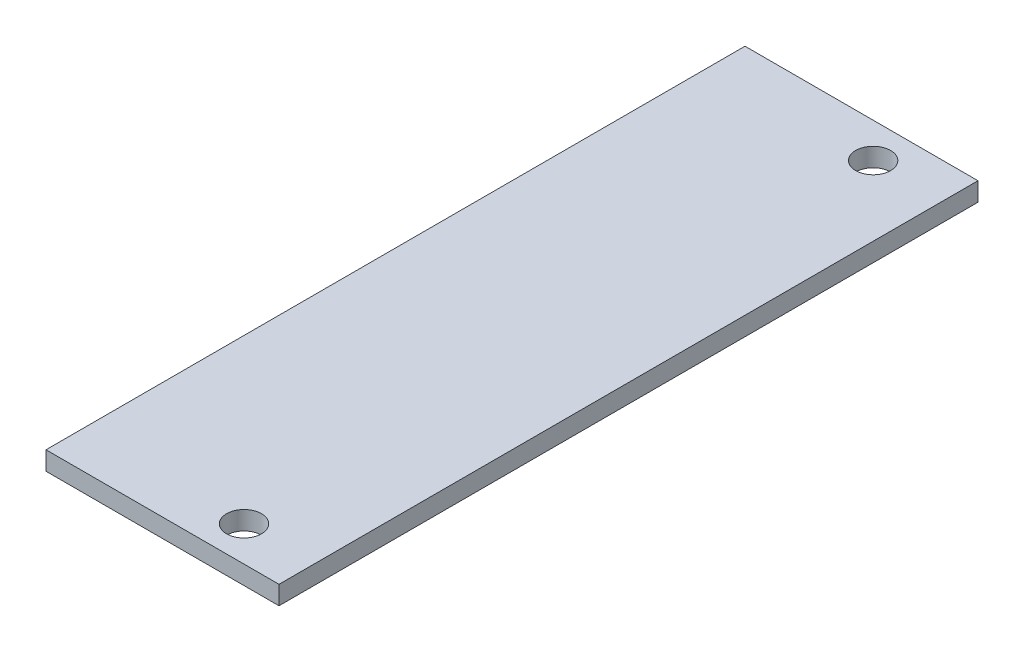
ISO-10303-21;
HEADER;
FILE_DESCRIPTION(('STEP AP214'),'2;1');
FILE_NAME('part.step','',(''),(''),'','','');
FILE_SCHEMA(('AUTOMOTIVE_DESIGN { 1 0 10303 214 1 1 1 1 }'));
ENDSEC;
DATA;
#1=APPLICATION_CONTEXT('core data for automotive mechanical design processes');
#2=APPLICATION_PROTOCOL_DEFINITION('international standard','automotive_design',2000,#1);
#3=PRODUCT_CONTEXT('',#1,'mechanical');
#4=PRODUCT('Part','Part','',(#3));
#5=PRODUCT_RELATED_PRODUCT_CATEGORY('part','',(#4));
#6=PRODUCT_DEFINITION_FORMATION('','',#4);
#7=PRODUCT_DEFINITION_CONTEXT('part definition',#1,'design');
#8=PRODUCT_DEFINITION('design','',#6,#7);
#9=PRODUCT_DEFINITION_SHAPE('','',#8);
#10=(LENGTH_UNIT() NAMED_UNIT(*) SI_UNIT(.MILLI.,.METRE.));
#11=(NAMED_UNIT(*) PLANE_ANGLE_UNIT() SI_UNIT($,.RADIAN.));
#12=(NAMED_UNIT(*) SI_UNIT($,.STERADIAN.) SOLID_ANGLE_UNIT());
#13=UNCERTAINTY_MEASURE_WITH_UNIT(LENGTH_MEASURE(1.E-05),#10,'distance_accuracy_value','');
#14=(GEOMETRIC_REPRESENTATION_CONTEXT(3) GLOBAL_UNCERTAINTY_ASSIGNED_CONTEXT((#13)) GLOBAL_UNIT_ASSIGNED_CONTEXT((#10,
#11,#12)) REPRESENTATION_CONTEXT('',''));
#15=CARTESIAN_POINT('',(0.,0.,0.));
#16=DIRECTION('',(0.,0.,1.));
#17=DIRECTION('',(1.,0.,0.));
#18=AXIS2_PLACEMENT_3D('',#15,#16,#17);
#19=CARTESIAN_POINT('',(0.,1.6,0.));
#20=DIRECTION('',(0.,-1.,0.));
#21=DIRECTION('',(0.,0.,-1.));
#22=AXIS2_PLACEMENT_3D('',#19,#20,#21);
#23=PLANE('',#22);
#24=DIRECTION('',(0.,0.,1.));
#25=VECTOR('',#24,1.);
#26=CARTESIAN_POINT('',(0.,1.6,0.));
#27=LINE('',#26,#25);
#28=CARTESIAN_POINT('',(0.,1.6,-60.));
#29=VERTEX_POINT('',#28);
#30=CARTESIAN_POINT('',(0.,1.6,0.));
#31=VERTEX_POINT('',#30);
#32=EDGE_CURVE('E91',#29,#31,#27,.T.);
#33=ORIENTED_EDGE('',*,*,#32,.T.);
#34=DIRECTION('',(1.,0.,0.));
#35=VECTOR('',#34,1.);
#36=CARTESIAN_POINT('',(0.,1.6,0.));
#37=LINE('',#36,#35);
#38=CARTESIAN_POINT('',(20.,1.6,0.));
#39=VERTEX_POINT('',#38);
#40=EDGE_CURVE('E86',#31,#39,#37,.T.);
#41=ORIENTED_EDGE('',*,*,#40,.T.);
#42=DIRECTION('',(0.,0.,-1.));
#43=VECTOR('',#42,1.);
#44=CARTESIAN_POINT('',(20.,1.6,0.));
#45=LINE('',#44,#43);
#46=CARTESIAN_POINT('',(20.,1.6,-60.));
#47=VERTEX_POINT('',#46);
#48=EDGE_CURVE('E93',#39,#47,#45,.T.);
#49=ORIENTED_EDGE('',*,*,#48,.T.);
#50=DIRECTION('',(-1.,0.,0.));
#51=VECTOR('',#50,1.);
#52=CARTESIAN_POINT('',(0.,1.6,-60.));
#53=LINE('',#52,#51);
#54=EDGE_CURVE('E59',#47,#29,#53,.T.);
#55=ORIENTED_EDGE('',*,*,#54,.T.);
#56=EDGE_LOOP('',(#33,#41,#49,#55));
#57=FACE_BOUND('',#56,.T.);
#58=CARTESIAN_POINT('',(14.,1.6,-3.));
#59=DIRECTION('',(0.,1.,0.));
#60=DIRECTION('',(0.,0.,1.));
#61=AXIS2_PLACEMENT_3D('',#58,#59,#60);
#62=CIRCLE('',#61,1.5);
#63=CARTESIAN_POINT('',(14.,1.6,-1.5));
#64=VERTEX_POINT('',#63);
#65=EDGE_CURVE('E107',#64,#64,#62,.T.);
#66=ORIENTED_EDGE('',*,*,#65,.F.);
#67=EDGE_LOOP('',(#66));
#68=FACE_BOUND('',#67,.T.);
#69=CARTESIAN_POINT('',(14.,1.6,-57.));
#70=DIRECTION('',(0.,1.,0.));
#71=DIRECTION('',(0.,0.,1.));
#72=AXIS2_PLACEMENT_3D('',#69,#70,#71);
#73=CIRCLE('',#72,1.5);
#74=CARTESIAN_POINT('',(14.,1.6,-55.5));
#75=VERTEX_POINT('',#74);
#76=EDGE_CURVE('E125',#75,#75,#73,.T.);
#77=ORIENTED_EDGE('',*,*,#76,.F.);
#78=EDGE_LOOP('',(#77));
#79=FACE_BOUND('',#78,.T.);
#80=ADVANCED_FACE('F41',(#57,#68,#79),#23,.F.);
#81=CARTESIAN_POINT('',(0.,0.,0.));
#82=DIRECTION('',(0.,-1.,0.));
#83=DIRECTION('',(0.,0.,-1.));
#84=AXIS2_PLACEMENT_3D('',#81,#82,#83);
#85=PLANE('',#84);
#86=CARTESIAN_POINT('',(14.,0.,-3.));
#87=DIRECTION('',(0.,1.,0.));
#88=DIRECTION('',(0.,0.,1.));
#89=AXIS2_PLACEMENT_3D('',#86,#87,#88);
#90=CIRCLE('',#89,1.5);
#91=CARTESIAN_POINT('',(14.,0.,-1.5));
#92=VERTEX_POINT('',#91);
#93=EDGE_CURVE('E118',#92,#92,#90,.T.);
#94=ORIENTED_EDGE('',*,*,#93,.T.);
#95=EDGE_LOOP('',(#94));
#96=FACE_BOUND('',#95,.T.);
#97=DIRECTION('',(0.,0.,1.));
#98=VECTOR('',#97,1.);
#99=CARTESIAN_POINT('',(0.,0.,0.));
#100=LINE('',#99,#98);
#101=CARTESIAN_POINT('',(0.,0.,-60.));
#102=VERTEX_POINT('',#101);
#103=CARTESIAN_POINT('',(0.,0.,0.));
#104=VERTEX_POINT('',#103);
#105=EDGE_CURVE('E104',#102,#104,#100,.T.);
#106=ORIENTED_EDGE('',*,*,#105,.F.);
#107=DIRECTION('',(-1.,0.,0.));
#108=VECTOR('',#107,1.);
#109=CARTESIAN_POINT('',(0.,0.,-60.));
#110=LINE('',#109,#108);
#111=CARTESIAN_POINT('',(20.,0.,-60.));
#112=VERTEX_POINT('',#111);
#113=EDGE_CURVE('E84',#112,#102,#110,.T.);
#114=ORIENTED_EDGE('',*,*,#113,.F.);
#115=DIRECTION('',(0.,0.,-1.));
#116=VECTOR('',#115,1.);
#117=CARTESIAN_POINT('',(20.,0.,0.));
#118=LINE('',#117,#116);
#119=CARTESIAN_POINT('',(20.,0.,0.));
#120=VERTEX_POINT('',#119);
#121=EDGE_CURVE('E73',#120,#112,#118,.T.);
#122=ORIENTED_EDGE('',*,*,#121,.F.);
#123=DIRECTION('',(1.,0.,0.));
#124=VECTOR('',#123,1.);
#125=CARTESIAN_POINT('',(0.,0.,0.));
#126=LINE('',#125,#124);
#127=EDGE_CURVE('E100',#104,#120,#126,.T.);
#128=ORIENTED_EDGE('',*,*,#127,.F.);
#129=EDGE_LOOP('',(#106,#114,#122,#128));
#130=FACE_BOUND('',#129,.T.);
#131=CARTESIAN_POINT('',(14.,0.,-57.));
#132=DIRECTION('',(0.,1.,0.));
#133=DIRECTION('',(0.,0.,1.));
#134=AXIS2_PLACEMENT_3D('',#131,#132,#133);
#135=CIRCLE('',#134,1.5);
#136=CARTESIAN_POINT('',(14.,0.,-55.5));
#137=VERTEX_POINT('',#136);
#138=EDGE_CURVE('E127',#137,#137,#135,.T.);
#139=ORIENTED_EDGE('',*,*,#138,.T.);
#140=EDGE_LOOP('',(#139));
#141=FACE_BOUND('',#140,.T.);
#142=ADVANCED_FACE('F117',(#96,#130,#141),#85,.T.);
#143=CARTESIAN_POINT('',(0.,1.6,0.));
#144=DIRECTION('',(1.,0.,0.));
#145=DIRECTION('',(0.,0.,-1.));
#146=AXIS2_PLACEMENT_3D('',#143,#144,#145);
#147=PLANE('',#146);
#148=ORIENTED_EDGE('',*,*,#105,.T.);
#149=DIRECTION('',(0.,-1.,0.));
#150=VECTOR('',#149,1.);
#151=CARTESIAN_POINT('',(0.,1.6,0.));
#152=LINE('',#151,#150);
#153=EDGE_CURVE('E11',#31,#104,#152,.T.);
#154=ORIENTED_EDGE('',*,*,#153,.F.);
#155=ORIENTED_EDGE('',*,*,#32,.F.);
#156=DIRECTION('',(0.,-1.,0.));
#157=VECTOR('',#156,1.);
#158=CARTESIAN_POINT('',(0.,1.6,-60.));
#159=LINE('',#158,#157);
#160=EDGE_CURVE('E101',#29,#102,#159,.T.);
#161=ORIENTED_EDGE('',*,*,#160,.T.);
#162=EDGE_LOOP('',(#148,#154,#155,#161));
#163=FACE_BOUND('',#162,.T.);
#164=ADVANCED_FACE('F43',(#163),#147,.F.);
#165=CARTESIAN_POINT('',(0.,1.6,0.));
#166=DIRECTION('',(0.,0.,-1.));
#167=DIRECTION('',(-1.,0.,0.));
#168=AXIS2_PLACEMENT_3D('',#165,#166,#167);
#169=PLANE('',#168);
#170=ORIENTED_EDGE('',*,*,#127,.T.);
#171=DIRECTION('',(0.,-1.,0.));
#172=VECTOR('',#171,1.);
#173=CARTESIAN_POINT('',(20.,1.6,0.));
#174=LINE('',#173,#172);
#175=EDGE_CURVE('E49',#39,#120,#174,.T.);
#176=ORIENTED_EDGE('',*,*,#175,.F.);
#177=ORIENTED_EDGE('',*,*,#40,.F.);
#178=ORIENTED_EDGE('',*,*,#153,.T.);
#179=EDGE_LOOP('',(#170,#176,#177,#178));
#180=FACE_BOUND('',#179,.T.);
#181=ADVANCED_FACE('F96',(#180),#169,.F.);
#182=CARTESIAN_POINT('',(20.,1.6,0.));
#183=DIRECTION('',(-1.,0.,0.));
#184=DIRECTION('',(0.,0.,1.));
#185=AXIS2_PLACEMENT_3D('',#182,#183,#184);
#186=PLANE('',#185);
#187=ORIENTED_EDGE('',*,*,#121,.T.);
#188=DIRECTION('',(0.,-1.,0.));
#189=VECTOR('',#188,1.);
#190=CARTESIAN_POINT('',(20.,1.6,-60.));
#191=LINE('',#190,#189);
#192=EDGE_CURVE('E98',#47,#112,#191,.T.);
#193=ORIENTED_EDGE('',*,*,#192,.F.);
#194=ORIENTED_EDGE('',*,*,#48,.F.);
#195=ORIENTED_EDGE('',*,*,#175,.T.);
#196=EDGE_LOOP('',(#187,#193,#194,#195));
#197=FACE_BOUND('',#196,.T.);
#198=ADVANCED_FACE('F97',(#197),#186,.F.);
#199=CARTESIAN_POINT('',(0.,1.6,-60.));
#200=DIRECTION('',(0.,0.,1.));
#201=DIRECTION('',(1.,0.,0.));
#202=AXIS2_PLACEMENT_3D('',#199,#200,#201);
#203=PLANE('',#202);
#204=ORIENTED_EDGE('',*,*,#113,.T.);
#205=ORIENTED_EDGE('',*,*,#160,.F.);
#206=ORIENTED_EDGE('',*,*,#54,.F.);
#207=ORIENTED_EDGE('',*,*,#192,.T.);
#208=EDGE_LOOP('',(#204,#205,#206,#207));
#209=FACE_BOUND('',#208,.T.);
#210=ADVANCED_FACE('F114',(#209),#203,.F.);
#211=CARTESIAN_POINT('',(14.,1.6,-3.));
#212=DIRECTION('',(0.,-1.,0.));
#213=DIRECTION('',(0.,0.,-1.));
#214=AXIS2_PLACEMENT_3D('',#211,#212,#213);
#215=CYLINDRICAL_SURFACE('',#214,1.5);
#216=ORIENTED_EDGE('',*,*,#65,.T.);
#217=EDGE_LOOP('',(#216));
#218=FACE_BOUND('',#217,.T.);
#219=ORIENTED_EDGE('',*,*,#93,.F.);
#220=EDGE_LOOP('',(#219));
#221=FACE_BOUND('',#220,.T.);
#222=ADVANCED_FACE('F141',(#218,#221),#215,.F.);
#223=CARTESIAN_POINT('',(14.,1.6,-57.));
#224=DIRECTION('',(0.,-1.,0.));
#225=DIRECTION('',(0.,0.,-1.));
#226=AXIS2_PLACEMENT_3D('',#223,#224,#225);
#227=CYLINDRICAL_SURFACE('',#226,1.5);
#228=ORIENTED_EDGE('',*,*,#76,.T.);
#229=EDGE_LOOP('',(#228));
#230=FACE_BOUND('',#229,.T.);
#231=ORIENTED_EDGE('',*,*,#138,.F.);
#232=EDGE_LOOP('',(#231));
#233=FACE_BOUND('',#232,.T.);
#234=ADVANCED_FACE('F135',(#230,#233),#227,.F.);
#235=CLOSED_SHELL('',(#80,#142,#164,#181,#198,#210,#222,#234));
#236=MANIFOLD_SOLID_BREP('B2',#235);
#237=ADVANCED_BREP_SHAPE_REPRESENTATION('',(#18,#236),#14);
#238=SHAPE_DEFINITION_REPRESENTATION(#9,#237);
ENDSEC;
END-ISO-10303-21;
